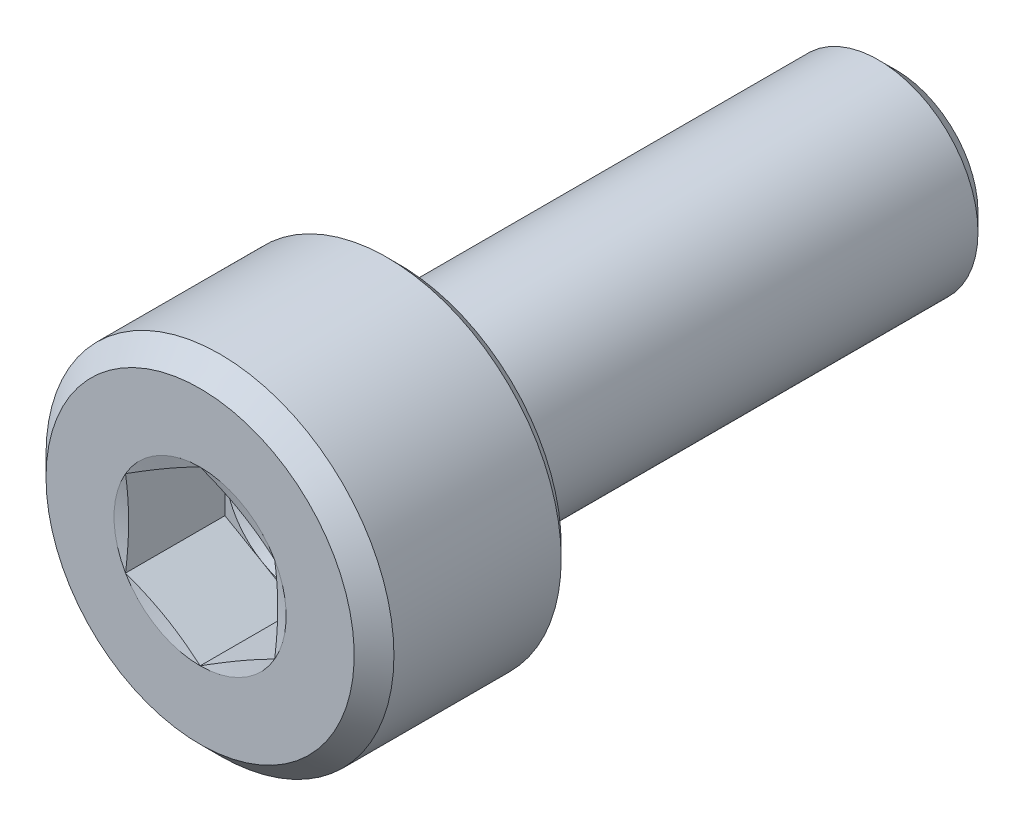
ISO-10303-21;
HEADER;
FILE_DESCRIPTION(('STEP AP214'),'2;1');
FILE_NAME('part.step','',(''),(''),'','','');
FILE_SCHEMA(('AUTOMOTIVE_DESIGN { 1 0 10303 214 1 1 1 1 }'));
ENDSEC;
DATA;
#1=APPLICATION_CONTEXT('core data for automotive mechanical design processes');
#2=APPLICATION_PROTOCOL_DEFINITION('international standard','automotive_design',2000,#1);
#3=PRODUCT_CONTEXT('',#1,'mechanical');
#4=PRODUCT('Part','Part','',(#3));
#5=PRODUCT_RELATED_PRODUCT_CATEGORY('part','',(#4));
#6=PRODUCT_DEFINITION_FORMATION('','',#4);
#7=PRODUCT_DEFINITION_CONTEXT('part definition',#1,'design');
#8=PRODUCT_DEFINITION('design','',#6,#7);
#9=PRODUCT_DEFINITION_SHAPE('','',#8);
#10=(LENGTH_UNIT() NAMED_UNIT(*) SI_UNIT(.MILLI.,.METRE.));
#11=(NAMED_UNIT(*) PLANE_ANGLE_UNIT() SI_UNIT($,.RADIAN.));
#12=(NAMED_UNIT(*) SI_UNIT($,.STERADIAN.) SOLID_ANGLE_UNIT());
#13=UNCERTAINTY_MEASURE_WITH_UNIT(LENGTH_MEASURE(1.E-05),#10,'distance_accuracy_value','');
#14=(GEOMETRIC_REPRESENTATION_CONTEXT(3) GLOBAL_UNCERTAINTY_ASSIGNED_CONTEXT((#13)) GLOBAL_UNIT_ASSIGNED_CONTEXT((#10,
#11,#12)) REPRESENTATION_CONTEXT('',''));
#15=CARTESIAN_POINT('',(0.,0.,0.));
#16=DIRECTION('',(0.,0.,1.));
#17=DIRECTION('',(1.,0.,0.));
#18=AXIS2_PLACEMENT_3D('',#15,#16,#17);
#19=CARTESIAN_POINT('',(1.5,0.86602540378444,-2.));
#20=DIRECTION('',(0.5,0.866025403784439,0.));
#21=DIRECTION('',(0.,0.,-1.));
#22=AXIS2_PLACEMENT_3D('',#19,#20,#21);
#23=PLANE('',#22);
#24=CARTESIAN_POINT('',(0.,1.73205080756888,0.));
#25=CARTESIAN_POINT('',(0.0319218435573803,1.71361827752424,-0.00493884412449916));
#26=CARTESIAN_POINT('',(0.0638693685136447,1.69516679835816,-0.00964662265875806));
#27=CARTESIAN_POINT('',(0.127190873346136,1.65859864303315,-0.0184608187710604));
#28=CARTESIAN_POINT('',(0.158563781120233,1.64048251630664,-0.0225772393424968));
#29=CARTESIAN_POINT('',(0.220898834307869,1.60450191917406,-0.0302102833005078));
#30=CARTESIAN_POINT('',(0.251860146436366,1.58663771475197,-0.0337349193355694));
#31=CARTESIAN_POINT('',(0.313549389158037,1.55105545933978,-0.0401848351737832));
#32=CARTESIAN_POINT('',(0.344276866814156,1.53333756463099,-0.0431152979201941));
#33=CARTESIAN_POINT('',(0.40657799028558,1.49735411977236,-0.0484651508275807));
#34=CARTESIAN_POINT('',(0.438151971802683,1.47908675491275,-0.0508685151660002));
#35=CARTESIAN_POINT('',(0.500879286230978,1.44279961674247,-0.0549795057892075));
#36=CARTESIAN_POINT('',(0.532032121379358,1.42478007054919,-0.0566966624855056));
#37=CARTESIAN_POINT('',(0.594231046797586,1.38885552555366,-0.0594386321092165));
#38=CARTESIAN_POINT('',(0.625276914041384,1.37095039752443,-0.0604667898057636));
#39=CARTESIAN_POINT('',(0.687554215894071,1.33505284045166,-0.0618381368687116));
#40=CARTESIAN_POINT('',(0.718785756622615,1.31706045545343,-0.0621776414822527));
#41=CARTESIAN_POINT('',(0.781203493670746,1.28102196252072,-0.0621780114361709));
#42=CARTESIAN_POINT('',(0.812389701902166,1.2629758752215,-0.0618391104492389));
#43=CARTESIAN_POINT('',(0.874602074626141,1.22699927809648,-0.0604685592128849));
#44=CARTESIAN_POINT('',(0.905628246509567,1.20906864719944,-0.0594404405458585));
#45=CARTESIAN_POINT('',(0.96784038831324,1.17316750001764,-0.0566983997404701));
#46=CARTESIAN_POINT('',(0.999026358555385,1.15519725365838,-0.0549809740548094));
#47=CARTESIAN_POINT('',(1.06183015892586,1.1190091539659,-0.0508694613979863));
#48=CARTESIAN_POINT('',(1.09344751791267,1.10079159059446,-0.0484656958203877));
#49=CARTESIAN_POINT('',(1.15576484073738,1.06482303125522,-0.0431161350968404));
#50=CARTESIAN_POINT('',(1.18646658596711,1.04707267876494,-0.0401866752582224));
#51=CARTESIAN_POINT('',(1.24811844318503,1.01144233108145,-0.0337380416147382));
#52=CARTESIAN_POINT('',(1.27906819922818,0.993562671876557,-0.0302136197071947));
#53=CARTESIAN_POINT('',(1.34139616186306,0.957570532953329,-0.0225805303875789));
#54=CARTESIAN_POINT('',(1.37277371933127,0.939458651913147,-0.0184637865548303));
#55=CARTESIAN_POINT('',(1.43611136843188,0.902901776632724,-0.00964841178692371));
#56=CARTESIAN_POINT('',(1.46807043895857,0.88445743514902,-0.00493971563973908));
#57=CARTESIAN_POINT('',(1.5,0.86602540378444,0.));
#58=B_SPLINE_CURVE_WITH_KNOTS('',3,(#24,#25,#26,#27,#28,#29,#30,#31,#32,#33,#34,#35,#36,#37,#38,
#39,#40,#41,#42,#43,#44,#45,#46,#47,#48,#49,#50,#51,#52,#53,#54,#55,#56,#57),.UNSPECIFIED.,.F.,
.F.,(4,2,2,2,2,2,2,2,2,2,2,2,2,2,2,2,4),(0.,0.111572720232699,0.220951956478326,
0.328703835667225,0.435471008922913,0.545135332388369,0.653218713706919,0.760773524264254,
0.868902322588974,0.976993883014083,1.08453576845485,1.19263132381972,1.30233363891238,
1.40908245805682,1.51682745868587,1.62621248072106,1.73780468248118),.UNSPECIFIED.);
#59=CARTESIAN_POINT('',(0.,1.73205080756888,0.));
#60=VERTEX_POINT('',#59);
#61=CARTESIAN_POINT('',(1.5,0.866025403784441,0.));
#62=VERTEX_POINT('',#61);
#63=EDGE_CURVE('E256',#60,#62,#58,.T.);
#64=ORIENTED_EDGE('',*,*,#63,.F.);
#65=DIRECTION('',(0.,0.,1.));
#66=VECTOR('',#65,1.);
#67=CARTESIAN_POINT('',(0.,1.73205080756888,-2.));
#68=LINE('',#67,#66);
#69=CARTESIAN_POINT('',(0.,1.73205080756888,-2.));
#70=VERTEX_POINT('',#69);
#71=EDGE_CURVE('E417',#70,#60,#68,.T.);
#72=ORIENTED_EDGE('',*,*,#71,.F.);
#73=DIRECTION('',(-0.866025403784439,0.5,0.));
#74=VECTOR('',#73,1.);
#75=CARTESIAN_POINT('',(1.5,0.86602540378444,-2.));
#76=LINE('',#75,#74);
#77=CARTESIAN_POINT('',(0.75,1.29903810567666,-2.));
#78=VERTEX_POINT('',#77);
#79=EDGE_CURVE('E126',#78,#70,#76,.T.);
#80=ORIENTED_EDGE('',*,*,#79,.F.);
#81=DIRECTION('',(-0.866025403784439,0.5,0.));
#82=VECTOR('',#81,1.);
#83=CARTESIAN_POINT('',(1.5,0.86602540378444,-2.));
#84=LINE('',#83,#82);
#85=CARTESIAN_POINT('',(1.5,0.86602540378444,-2.));
#86=VERTEX_POINT('',#85);
#87=EDGE_CURVE('E212',#86,#78,#84,.T.);
#88=ORIENTED_EDGE('',*,*,#87,.F.);
#89=DIRECTION('',(0.,0.,1.));
#90=VECTOR('',#89,1.);
#91=CARTESIAN_POINT('',(1.5,0.86602540378444,-2.));
#92=LINE('',#91,#90);
#93=EDGE_CURVE('E11',#86,#62,#92,.T.);
#94=ORIENTED_EDGE('',*,*,#93,.T.);
#95=EDGE_LOOP('',(#64,#72,#80,#88,#94));
#96=FACE_BOUND('',#95,.T.);
#97=ADVANCED_FACE('F16',(#96),#23,.F.);
#98=CARTESIAN_POINT('',(1.5,-0.866025403784439,-2.));
#99=DIRECTION('',(1.,0.,0.));
#100=DIRECTION('',(0.,-1.,0.));
#101=AXIS2_PLACEMENT_3D('',#98,#99,#100);
#102=PLANE('',#101);
#103=CARTESIAN_POINT('',(1.5,0.86602540378444,0.));
#104=CARTESIAN_POINT('',(1.49999788437901,0.829199928917708,-0.00493403058548651));
#105=CARTESIAN_POINT('',(1.49999212365608,0.792342804583024,-0.00963746630519228));
#106=CARTESIAN_POINT('',(1.49998367742636,0.719291943469374,-0.0184441406631844));
#107=CARTESIAN_POINT('',(1.49998093369849,0.68309940729587,-0.0225573596134164));
#108=CARTESIAN_POINT('',(1.49998795566567,0.611195736608794,-0.0301851630975857));
#109=CARTESIAN_POINT('',(1.49999753576162,0.575485455570638,-0.0337077471297975));
#110=CARTESIAN_POINT('',(1.50002680410694,0.504340575414326,-0.040154696010694));
#111=CARTESIAN_POINT('',(1.50004639897075,0.468906447013271,-0.0430842445185843));
#112=CARTESIAN_POINT('',(1.50003448346486,0.396956456479814,-0.048439196202735));
#113=CARTESIAN_POINT('',(1.50000145981111,0.360439301866925,-0.0508473248473678));
#114=CARTESIAN_POINT('',(1.49993852599375,0.287896529733626,-0.0549666645148848));
#115=CARTESIAN_POINT('',(1.49990857763219,0.25187146148816,-0.0566874732422629));
#116=CARTESIAN_POINT('',(1.49989756801784,0.179973446880944,-0.0594339881954357));
#117=CARTESIAN_POINT('',(1.49991626529232,0.144100631127306,-0.060463096019766));
#118=CARTESIAN_POINT('',(1.49996202085769,0.0721519187191579,-0.061839348150352));
#119=CARTESIAN_POINT('',(1.49998912289494,0.036075952496566,-0.0621828526918632));
#120=CARTESIAN_POINT('',(1.5,0.,-0.0621778264910693));
#121=B_SPLINE_CURVE_WITH_KNOTS('',3,(#103,#104,#105,#106,#107,#108,#109,#110,#111,#112,#113,
#114,#115,#116,#117,#118,#119,#120),.UNSPECIFIED.,.F.,.F.,(4,2,2,2,2,2,2,2,4),(0.,
0.111464002335777,0.220737054899247,0.328383540660502,0.435044078200038,0.544827888914773,
0.6530200605594,0.760676201428846,0.868902368325059),.UNSPECIFIED.);
#122=CARTESIAN_POINT('',(1.5,0.,-0.0621778264910693));
#123=VERTEX_POINT('',#122);
#124=EDGE_CURVE('E492',#62,#123,#121,.T.);
#125=ORIENTED_EDGE('',*,*,#124,.F.);
#126=ORIENTED_EDGE('',*,*,#93,.F.);
#127=DIRECTION('',(0.,1.,0.));
#128=VECTOR('',#127,1.);
#129=CARTESIAN_POINT('',(1.5,-0.866025403784439,-2.));
#130=LINE('',#129,#128);
#131=CARTESIAN_POINT('',(1.5,0.,-2.));
#132=VERTEX_POINT('',#131);
#133=EDGE_CURVE('E239',#132,#86,#130,.T.);
#134=ORIENTED_EDGE('',*,*,#133,.F.);
#135=DIRECTION('',(0.,1.,0.));
#136=VECTOR('',#135,1.);
#137=CARTESIAN_POINT('',(1.5,-0.866025403784439,-2.));
#138=LINE('',#137,#136);
#139=CARTESIAN_POINT('',(1.5,-0.866025403784439,-2.));
#140=VERTEX_POINT('',#139);
#141=EDGE_CURVE('E136',#140,#132,#138,.T.);
#142=ORIENTED_EDGE('',*,*,#141,.F.);
#143=DIRECTION('',(0.,0.,1.));
#144=VECTOR('',#143,1.);
#145=CARTESIAN_POINT('',(1.5,-0.866025403784439,-2.));
#146=LINE('',#145,#144);
#147=CARTESIAN_POINT('',(1.5,-0.866025403784438,0.));
#148=VERTEX_POINT('',#147);
#149=EDGE_CURVE('E29',#140,#148,#146,.T.);
#150=ORIENTED_EDGE('',*,*,#149,.T.);
#151=CARTESIAN_POINT('',(1.5,0.,-0.0621778264910693));
#152=CARTESIAN_POINT('',(1.49998917237469,-0.0360465890798884,-0.0621828333609689));
#153=CARTESIAN_POINT('',(1.49996321712326,-0.0720931866322869,-0.0618395946441951));
#154=CARTESIAN_POINT('',(1.49992055969235,-0.143989874327615,-0.0604646459344438));
#155=CARTESIAN_POINT('',(1.49990381112655,-0.179840031540118,-0.0594364461227482));
#156=CARTESIAN_POINT('',(1.49991820406301,-0.251698944784657,-0.056692482890539));
#157=CARTESIAN_POINT('',(1.49994959286198,-0.287707565805736,-0.0549732027081495));
#158=CARTESIAN_POINT('',(1.50001291187399,-0.360223225310859,-0.0508578079954488));
#159=CARTESIAN_POINT('',(1.5000448431949,-0.396729709706729,-0.0484520053406438));
#160=CARTESIAN_POINT('',(1.50005357837135,-0.468686666432951,-0.0431000871668579));
#161=CARTESIAN_POINT('',(1.5000318838889,-0.504138394952606,-0.0401707733030463));
#162=CARTESIAN_POINT('',(1.49999977329943,-0.57531955436455,-0.0337232219030494));
#163=CARTESIAN_POINT('',(1.49998946362536,-0.611048512498729,-0.0301997759390277));
#164=CARTESIAN_POINT('',(1.49998142841051,-0.682991208938279,-0.0225693637917121));
#165=CARTESIAN_POINT('',(1.49998389589917,-0.719204090436432,-0.0184543654872015));
#166=CARTESIAN_POINT('',(1.49999206648556,-0.792297816258988,-0.00964321952563205));
#167=CARTESIAN_POINT('',(1.49999783362551,-0.829177455418944,-0.0049370528179985));
#168=CARTESIAN_POINT('',(1.5,-0.866025403784436,0.));
#169=B_SPLINE_CURVE_WITH_KNOTS('',3,(#151,#152,#153,#154,#155,#156,#157,#158,#159,#160,#161,
#162,#163,#164,#165,#166,#167,#168),.UNSPECIFIED.,.F.,.F.,(4,2,2,2,2,2,2,2,4),(0.,
0.108138070217073,0.215726191203815,0.323868880462267,0.433620301314751,0.540333393586546,
0.64803588186531,0.757370175799668,0.868902207142523),.UNSPECIFIED.);
#170=EDGE_CURVE('E449',#123,#148,#169,.T.);
#171=ORIENTED_EDGE('',*,*,#170,.F.);
#172=EDGE_LOOP('',(#125,#126,#134,#142,#150,#171));
#173=FACE_BOUND('',#172,.T.);
#174=ADVANCED_FACE('F298',(#173),#102,.F.);
#175=CARTESIAN_POINT('',(0.,-1.73205080756887,-2.));
#176=DIRECTION('',(0.5,-0.866025403784439,0.));
#177=DIRECTION('',(0.,0.,-1.));
#178=AXIS2_PLACEMENT_3D('',#175,#176,#177);
#179=PLANE('',#178);
#180=CARTESIAN_POINT('',(1.5,-0.866025403784436,0.));
#181=CARTESIAN_POINT('',(1.46807603894706,-0.884454266218195,-0.00493884412443326));
#182=CARTESIAN_POINT('',(1.43612282677415,-0.902895894835115,-0.00964662265862214));
#183=CARTESIAN_POINT('',(1.37279312287752,-0.939449848963183,-0.0184608187708344));
#184=CARTESIAN_POINT('',(1.34141764302729,-0.957561520722868,-0.0225772393422461));
#185=CARTESIAN_POINT('',(1.27909000527335,-0.993554961763424,-0.0302102833002547));
#186=CARTESIAN_POINT('',(1.24813849436103,-1.01143614239027,-0.0337349193353338));
#187=CARTESIAN_POINT('',(1.1864787358887,-1.0470694660216,-0.0401848351736417));
#188=CARTESIAN_POINT('',(1.15577085014079,-1.06482129491176,-0.0431152979201243));
#189=CARTESIAN_POINT('',(1.09345771104134,-1.10078392809297,-0.0484651508276134));
#190=CARTESIAN_POINT('',(1.06185071825413,-1.11899411575542,-0.0508685151660728));
#191=CARTESIAN_POINT('',(0.999061477553865,-1.15517399447615,-0.0549795057893279));
#192=CARTESIAN_POINT('',(0.967879675211638,-1.17314336801787,-0.0566966624856342));
#193=CARTESIAN_POINT('',(0.905668643917024,-1.20904694502039,-0.0594386321093453));
#194=CARTESIAN_POINT('',(0.874639414563802,-1.22698089072146,-0.0604667898058839));
#195=CARTESIAN_POINT('',(0.812412567278663,-1.26296583766887,-0.0618381368687843));
#196=CARTESIAN_POINT('',(0.78121493443127,-1.28101695284018,-0.0621776414822849));
#197=CARTESIAN_POINT('',(0.71879581551281,-1.31705305230483,-0.0621780114361394));
#198=CARTESIAN_POINT('',(0.687574341356492,-1.33503805723177,-0.0618391104491723));
#199=CARTESIAN_POINT('',(0.625311507941697,-1.37092725387842,-0.0604685592127698));
#200=CARTESIAN_POINT('',(0.594270040137024,-1.38883139146319,-0.0594404405457388));
#201=CARTESIAN_POINT('',(0.532072663750656,-1.42475811309799,-0.0566983997403538));
#202=CARTESIAN_POINT('',(0.500916988770352,-1.44278083238954,-0.0549809740547099));
#203=CARTESIAN_POINT('',(0.438175274937558,-1.47907646911783,-0.0508694613979232));
#204=CARTESIAN_POINT('',(0.406589722770089,-1.49734912351494,-0.0484656958203525));
#205=CARTESIAN_POINT('',(0.344281375232864,-1.53333322850726,-0.0431161350968009));
#206=CARTESIAN_POINT('',(0.313558246435083,-1.55104654357181,-0.0401866752581339));
#207=CARTESIAN_POINT('',(0.251875531586233,-1.58662344427154,-0.0337380416145872));
#208=CARTESIAN_POINT('',(0.220916414482101,-1.60448688964343,-0.0302136197070334));
#209=CARTESIAN_POINT('',(0.158582326520561,-1.64046841918969,-0.0225805303874198));
#210=CARTESIAN_POINT('',(0.127208198695392,-1.6585862405457,-0.0184637865546869));
#211=CARTESIAN_POINT('',(0.0638801914695765,-1.69515981604234,-0.00964841178683726));
#212=CARTESIAN_POINT('',(0.0319273879255215,-1.71361501225776,-0.00493971563969701));
#213=CARTESIAN_POINT('',(0.,-1.73205080756888,0.));
#214=B_SPLINE_CURVE_WITH_KNOTS('',3,(#180,#181,#182,#183,#184,#185,#186,#187,#188,#189,#190,
#191,#192,#193,#194,#195,#196,#197,#198,#199,#200,#201,#202,#203,#204,#205,#206,#207,#208,#209,
#210,#211,#212,#213),.UNSPECIFIED.,.F.,.F.,(4,2,2,2,2,2,2,2,2,2,2,2,2,2,2,2,4),(0.,
0.111572720231218,0.220951956476404,0.328703835665831,0.435471008922919,0.54513533238821,
0.653218713706672,0.760773524264044,0.868902322588982,0.976993883016217,1.08453576845772,
1.1926313238219,1.30233363891239,1.40908245805771,1.51682745868709,1.62621248072201,
1.73780468248119),.UNSPECIFIED.);
#215=CARTESIAN_POINT('',(0.,-1.73205080756888,0.));
#216=VERTEX_POINT('',#215);
#217=EDGE_CURVE('E454',#148,#216,#214,.T.);
#218=ORIENTED_EDGE('',*,*,#217,.F.);
#219=ORIENTED_EDGE('',*,*,#149,.F.);
#220=DIRECTION('',(0.866025403784439,0.5,0.));
#221=VECTOR('',#220,1.);
#222=CARTESIAN_POINT('',(0.,-1.73205080756887,-2.));
#223=LINE('',#222,#221);
#224=CARTESIAN_POINT('',(0.75,-1.29903810567666,-2.));
#225=VERTEX_POINT('',#224);
#226=EDGE_CURVE('E209',#225,#140,#223,.T.);
#227=ORIENTED_EDGE('',*,*,#226,.F.);
#228=DIRECTION('',(0.866025403784439,0.5,0.));
#229=VECTOR('',#228,1.);
#230=CARTESIAN_POINT('',(0.,-1.73205080756887,-2.));
#231=LINE('',#230,#229);
#232=CARTESIAN_POINT('',(0.,-1.73205080756887,-2.));
#233=VERTEX_POINT('',#232);
#234=EDGE_CURVE('E149',#233,#225,#231,.T.);
#235=ORIENTED_EDGE('',*,*,#234,.F.);
#236=DIRECTION('',(0.,0.,1.));
#237=VECTOR('',#236,1.);
#238=CARTESIAN_POINT('',(0.,-1.73205080756887,-2.));
#239=LINE('',#238,#237);
#240=EDGE_CURVE('E316',#233,#216,#239,.T.);
#241=ORIENTED_EDGE('',*,*,#240,.T.);
#242=EDGE_LOOP('',(#218,#219,#227,#235,#241));
#243=FACE_BOUND('',#242,.T.);
#244=ADVANCED_FACE('F293',(#243),#179,.F.);
#245=CARTESIAN_POINT('',(-1.5,-0.866025403784438,-2.));
#246=DIRECTION('',(-0.5,-0.866025403784439,0.));
#247=DIRECTION('',(-0.866025403784439,0.5,0.));
#248=AXIS2_PLACEMENT_3D('',#245,#246,#247);
#249=PLANE('',#248);
#250=CARTESIAN_POINT('',(0.,-1.73205080756888,0.));
#251=CARTESIAN_POINT('',(-0.0319218435569443,-1.71361827752449,-0.00493884412443161));
#252=CARTESIAN_POINT('',(-0.0638693685127974,-1.69516679835871,-0.00964662265861877));
#253=CARTESIAN_POINT('',(-0.127190873344782,-1.65859864303412,-0.0184608187708289));
#254=CARTESIAN_POINT('',(-0.158563781118785,-1.64048251630774,-0.0225772393422399));
#255=CARTESIAN_POINT('',(-0.220898834306495,-1.60450191917523,-0.0302102833002482));
#256=CARTESIAN_POINT('',(-0.251860146435161,-1.58663771475308,-0.0337349193353275));
#257=CARTESIAN_POINT('',(-0.313549389157348,-1.55105545934048,-0.0401848351736387));
#258=CARTESIAN_POINT('',(-0.344276866813814,-1.53333756463134,-0.0431152979201242));
#259=CARTESIAN_POINT('',(-0.406577990285268,-1.49735411977238,-0.0484651508275963));
#260=CARTESIAN_POINT('',(-0.438151971802054,-1.47908675491278,-0.0508685151660395));
#261=CARTESIAN_POINT('',(-0.500879286229949,-1.44279961674256,-0.0549795057892744));
#262=CARTESIAN_POINT('',(-0.532032121378246,-1.42478007054933,-0.0566966624855738));
#263=CARTESIAN_POINT('',(-0.594231046796497,-1.38885552555386,-0.0594386321092837));
#264=CARTESIAN_POINT('',(-0.625276914040401,-1.37095039752462,-0.0604667898058252));
#265=CARTESIAN_POINT('',(-0.687554215893493,-1.3350528404518,-0.06183813686875));
#266=CARTESIAN_POINT('',(-0.718785756622337,-1.31706045545352,-0.0621776414822695));
#267=CARTESIAN_POINT('',(-0.781203493671238,-1.2810219625205,-0.0621780114361548));
#268=CARTESIAN_POINT('',(-0.812389701903129,-1.26297587522104,-0.0618391104492068));
#269=CARTESIAN_POINT('',(-0.874602074627703,-1.22699927809563,-0.0604685592128287));
#270=CARTESIAN_POINT('',(-0.905628246511258,-1.20906864719845,-0.0594404405458008));
#271=CARTESIAN_POINT('',(-0.967840388314882,-1.17316750001655,-0.0566983997404147));
#272=CARTESIAN_POINT('',(-0.999026358556849,-1.15519725365733,-0.0549809740547644));
#273=CARTESIAN_POINT('',(-1.06183015892671,-1.11900915396522,-0.0508694613979569));
#274=CARTESIAN_POINT('',(-1.09344751791309,-1.10079159059412,-0.0484656958203696));
#275=CARTESIAN_POINT('',(-1.1557648407377,-1.06482303125513,-0.0431161350967959));
#276=CARTESIAN_POINT('',(-1.18646658596774,-1.04707267876477,-0.0401866752581259));
#277=CARTESIAN_POINT('',(-1.24811844318608,-1.01144233108113,-0.0337380416145749));
#278=CARTESIAN_POINT('',(-1.27906819922932,-0.993562671876153,-0.03021361970702));
#279=CARTESIAN_POINT('',(-1.34139616186418,-0.957570532952857,-0.0225805303874063));
#280=CARTESIAN_POINT('',(-1.37277371933229,-0.939458651912687,-0.0184637865546747));
#281=CARTESIAN_POINT('',(-1.43611136843248,-0.902901776632417,-0.00964841178682995));
#282=CARTESIAN_POINT('',(-1.46807043895887,-0.884457435148856,-0.00493971563969346));
#283=CARTESIAN_POINT('',(-1.5,-0.866025403784444,0.));
#284=B_SPLINE_CURVE_WITH_KNOTS('',3,(#250,#251,#252,#253,#254,#255,#256,#257,#258,#259,#260,
#261,#262,#263,#264,#265,#266,#267,#268,#269,#270,#271,#272,#273,#274,#275,#276,#277,#278,#279,
#280,#281,#282,#283),.UNSPECIFIED.,.F.,.F.,(4,2,2,2,2,2,2,2,2,2,2,2,2,2,2,2,4),(0.,
0.11157272023118,0.220951956476355,0.328703835665791,0.435471008922913,0.545135332387537,
0.653218713705794,0.760773524263399,0.868902322588981,0.976993883015684,1.084535768457,
1.19263132382134,1.30233363891239,1.40908245805779,1.5168274586872,1.62621248072208,
1.73780468248118),.UNSPECIFIED.);
#285=CARTESIAN_POINT('',(-1.5,-0.866025403784441,0.));
#286=VERTEX_POINT('',#285);
#287=EDGE_CURVE('E342',#216,#286,#284,.T.);
#288=ORIENTED_EDGE('',*,*,#287,.F.);
#289=ORIENTED_EDGE('',*,*,#240,.F.);
#290=DIRECTION('',(0.866025403784439,-0.5,0.));
#291=VECTOR('',#290,1.);
#292=CARTESIAN_POINT('',(-1.5,-0.866025403784438,-2.));
#293=LINE('',#292,#291);
#294=CARTESIAN_POINT('',(-0.75,-1.29903810567666,-2.));
#295=VERTEX_POINT('',#294);
#296=EDGE_CURVE('E224',#295,#233,#293,.T.);
#297=ORIENTED_EDGE('',*,*,#296,.F.);
#298=DIRECTION('',(0.866025403784439,-0.5,0.));
#299=VECTOR('',#298,1.);
#300=CARTESIAN_POINT('',(-1.5,-0.866025403784438,-2.));
#301=LINE('',#300,#299);
#302=CARTESIAN_POINT('',(-1.5,-0.866025403784438,-2.));
#303=VERTEX_POINT('',#302);
#304=EDGE_CURVE('E198',#303,#295,#301,.T.);
#305=ORIENTED_EDGE('',*,*,#304,.F.);
#306=DIRECTION('',(0.,0.,1.));
#307=VECTOR('',#306,1.);
#308=CARTESIAN_POINT('',(-1.5,-0.866025403784438,-2.));
#309=LINE('',#308,#307);
#310=EDGE_CURVE('E329',#303,#286,#309,.T.);
#311=ORIENTED_EDGE('',*,*,#310,.T.);
#312=EDGE_LOOP('',(#288,#289,#297,#305,#311));
#313=FACE_BOUND('',#312,.T.);
#314=ADVANCED_FACE('F297',(#313),#249,.F.);
#315=CARTESIAN_POINT('',(-1.5,0.86602540378444,-2.));
#316=DIRECTION('',(-1.,0.,0.));
#317=DIRECTION('',(0.,0.,1.));
#318=AXIS2_PLACEMENT_3D('',#315,#316,#317);
#319=PLANE('',#318);
#320=CARTESIAN_POINT('',(-1.5,-0.866025403784444,0.));
#321=CARTESIAN_POINT('',(-1.49999785704583,-0.829118007047485,-0.00494501576360788));
#322=CARTESIAN_POINT('',(-1.49999259051275,-0.792178800357398,-0.00965828039353506));
#323=CARTESIAN_POINT('',(-1.49998571753542,-0.718964095246033,-0.0184820232028856));
#324=CARTESIAN_POINT('',(-1.49998404127704,-0.682689801352141,-0.0226025173975769));
#325=CARTESIAN_POINT('',(-1.49999334263018,-0.610621683828277,-0.0302422926175349));
#326=CARTESIAN_POINT('',(-1.5000041329169,-0.574828714317346,-0.0337695848077828));
#327=CARTESIAN_POINT('',(-1.50003530309437,-0.503516074393159,-0.040223386947631));
#328=CARTESIAN_POINT('',(-1.5000555950549,-0.467996872155556,-0.0431550593772779));
#329=CARTESIAN_POINT('',(-1.50004365096737,-0.395917674670658,-0.048508264506497));
#330=CARTESIAN_POINT('',(-1.50000992517332,-0.359356438333572,-0.0509131764932561));
#331=CARTESIAN_POINT('',(-1.49994602299741,-0.286727055786137,-0.0550239062884565));
#332=CARTESIAN_POINT('',(-1.49991580218215,-0.250659459534994,-0.0567393694733551));
#333=CARTESIAN_POINT('',(-1.49990161802752,-0.178676428175191,-0.05947462175525));
#334=CARTESIAN_POINT('',(-1.49991742656152,-0.142761123136474,-0.060497810819715));
#335=CARTESIAN_POINT('',(-1.49996695712204,-0.0707259651243944,-0.0618559402838836));
#336=CARTESIAN_POINT('',(-1.50000077423698,-0.0346060428143578,-0.0621871809405733));
#337=CARTESIAN_POINT('',(-1.49999922827671,0.0375163454427191,-0.0621680937314055));
#338=CARTESIAN_POINT('',(-1.49996408945079,0.0735188119956903,-0.061819975207021));
#339=CARTESIAN_POINT('',(-1.49991363568062,0.145328707173365,-0.0604323235082698));
#340=CARTESIAN_POINT('',(-1.49989822156939,0.1811362029976,-0.0593962891611449));
#341=CARTESIAN_POINT('',(-1.49991255470042,0.252909744257705,-0.0566396987586207));
#342=CARTESIAN_POINT('',(-1.49994253544849,0.288875654121043,-0.0549156372223943));
#343=CARTESIAN_POINT('',(-1.50000405152831,0.361304331881828,-0.05079210067078));
#344=CARTESIAN_POINT('',(-1.50003560333469,0.397766546398477,-0.0483829754895413));
#345=CARTESIAN_POINT('',(-1.50004454637235,0.469594312950293,-0.04302926669563));
#346=CARTESIAN_POINT('',(-1.50002347300874,0.504961172034931,-0.0401021250666466));
#347=CARTESIAN_POINT('',(-1.49999320024247,0.575974957711393,-0.0336614679609277));
#348=CARTESIAN_POINT('',(-1.49998411376892,0.611621409044824,-0.0301427229573248));
#349=CARTESIAN_POINT('',(-1.49997835783799,0.683400006980931,-0.0225242698854443));
#350=CARTESIAN_POINT('',(-1.49998187928113,0.7195312974495,-0.0184165418148768));
#351=CARTESIAN_POINT('',(-1.4999916000686,0.792461504347963,-0.0096224450166885));
#352=CARTESIAN_POINT('',(-1.49999785189064,0.829259219546507,-0.00492609301900303));
#353=CARTESIAN_POINT('',(-1.5,0.866025403784438,0.));
#354=B_SPLINE_CURVE_WITH_KNOTS('',3,(#320,#321,#322,#323,#324,#325,#326,#327,#328,#329,#330,
#331,#332,#333,#334,#335,#336,#337,#338,#339,#340,#341,#342,#343,#344,#345,#346,#347,#348,#349,
#350,#351,#352,#353),.UNSPECIFIED.,.F.,.F.,(4,2,2,2,2,2,2,2,2,2,2,2,2,2,2,2,4),(0.,
0.111711969879774,0.221231164281875,0.329125871340509,0.436041258334956,0.545956358266136,
0.654275218879987,0.762058154278094,0.870415928826334,0.9784219006474,1.08588270569063,
1.19389815741617,1.30351771993845,1.40997657219085,1.51743138131477,1.6265200328025,
1.73780457403362),.UNSPECIFIED.);
#355=CARTESIAN_POINT('',(-1.5,0.86602540378444,0.));
#356=VERTEX_POINT('',#355);
#357=EDGE_CURVE('E382',#286,#356,#354,.T.);
#358=ORIENTED_EDGE('',*,*,#357,.F.);
#359=ORIENTED_EDGE('',*,*,#310,.F.);
#360=DIRECTION('',(0.,-1.,0.));
#361=VECTOR('',#360,1.);
#362=CARTESIAN_POINT('',(-1.5,0.86602540378444,-2.));
#363=LINE('',#362,#361);
#364=CARTESIAN_POINT('',(-1.5,0.,-2.));
#365=VERTEX_POINT('',#364);
#366=EDGE_CURVE('E247',#365,#303,#363,.T.);
#367=ORIENTED_EDGE('',*,*,#366,.F.);
#368=DIRECTION('',(0.,-1.,0.));
#369=VECTOR('',#368,1.);
#370=CARTESIAN_POINT('',(-1.5,0.86602540378444,-2.));
#371=LINE('',#370,#369);
#372=CARTESIAN_POINT('',(-1.5,0.86602540378444,-2.));
#373=VERTEX_POINT('',#372);
#374=EDGE_CURVE('E200',#373,#365,#371,.T.);
#375=ORIENTED_EDGE('',*,*,#374,.F.);
#376=DIRECTION('',(0.,0.,1.));
#377=VECTOR('',#376,1.);
#378=CARTESIAN_POINT('',(-1.5,0.86602540378444,-2.));
#379=LINE('',#378,#377);
#380=EDGE_CURVE('E44',#373,#356,#379,.T.);
#381=ORIENTED_EDGE('',*,*,#380,.T.);
#382=EDGE_LOOP('',(#358,#359,#367,#375,#381));
#383=FACE_BOUND('',#382,.T.);
#384=ADVANCED_FACE('F389',(#383),#319,.F.);
#385=CARTESIAN_POINT('',(0.,1.73205080756888,-2.));
#386=DIRECTION('',(-0.5,0.866025403784439,0.));
#387=DIRECTION('',(0.,0.,1.));
#388=AXIS2_PLACEMENT_3D('',#385,#386,#387);
#389=PLANE('',#388);
#390=CARTESIAN_POINT('',(-1.5,0.866025403784438,0.));
#391=CARTESIAN_POINT('',(-1.4680760389469,0.884454266218287,-0.00493884412445722));
#392=CARTESIAN_POINT('',(-1.43612282677384,0.902895894835281,-0.00964662265867159));
#393=CARTESIAN_POINT('',(-1.37279312287698,0.93944984896343,-0.0184608187709167));
#394=CARTESIAN_POINT('',(-1.34141764302669,0.957561520723122,-0.0225772393423374));
#395=CARTESIAN_POINT('',(-1.27909000527274,0.993554961763642,-0.0302102833003466));
#396=CARTESIAN_POINT('',(-1.24813849436048,1.01143614239044,-0.033734919335419));
#397=CARTESIAN_POINT('',(-1.18647873588836,1.04706946602169,-0.0401848351736938));
#398=CARTESIAN_POINT('',(-1.15577085014062,1.06482129491179,-0.0431152979201517));
#399=CARTESIAN_POINT('',(-1.09345771104158,1.10078392809289,-0.0484651508275798));
#400=CARTESIAN_POINT('',(-1.06185071825463,1.11899411575529,-0.0508685151660037));
#401=CARTESIAN_POINT('',(-0.999061477554704,1.15517399447597,-0.0549795057892155));
#402=CARTESIAN_POINT('',(-0.967879675212563,1.17314336801771,-0.0566966624855106));
#403=CARTESIAN_POINT('',(-0.90566864391796,1.20904694502028,-0.0594386321092195));
#404=CARTESIAN_POINT('',(-0.874639414564665,1.2269808907214,-0.060466789805764));
#405=CARTESIAN_POINT('',(-0.812412567279182,1.26296583766885,-0.0618381368687151));
#406=CARTESIAN_POINT('',(-0.781214934431518,1.28101695284015,-0.062177641482258));
#407=CARTESIAN_POINT('',(-0.718795815513718,1.3170530523042,-0.0621780114361658));
#408=CARTESIAN_POINT('',(-0.687574341358331,1.33503805723053,-0.0618391104492348));
#409=CARTESIAN_POINT('',(-0.62531150794486,1.3709272538765,-0.060468559212884));
#410=CARTESIAN_POINT('',(-0.594270040140579,1.38883139146119,-0.0594404405458545));
#411=CARTESIAN_POINT('',(-0.532072663754341,1.42475811309619,-0.056698399740464));
#412=CARTESIAN_POINT('',(-0.500916988773776,1.44278083238801,-0.054980974054799));
#413=CARTESIAN_POINT('',(-0.438175274939668,1.479076469117,-0.050869461397982));
#414=CARTESIAN_POINT('',(-0.406589722771145,1.49734912351454,-0.0484656958203894));
#415=CARTESIAN_POINT('',(-0.344281375233356,1.53333322850678,-0.0431161350968965));
#416=CARTESIAN_POINT('',(-0.313558246436066,1.55104654357081,-0.0401866752583401));
#417=CARTESIAN_POINT('',(-0.251875531587953,1.58662344426995,-0.0337380416149358));
#418=CARTESIAN_POINT('',(-0.220916414484067,1.60448688964175,-0.0302136197074065));
#419=CARTESIAN_POINT('',(-0.158582326522636,1.64046841918812,-0.0225805303877882));
#420=CARTESIAN_POINT('',(-0.127208198697331,1.65858624054432,-0.018463786555019));
#421=CARTESIAN_POINT('',(-0.0638801914707876,1.69515981604156,-0.00964841178703725));
#422=CARTESIAN_POINT('',(-0.031927387926141,1.7136150122574,-0.00493971563979419));
#423=CARTESIAN_POINT('',(0.,1.73205080756888,0.));
#424=B_SPLINE_CURVE_WITH_KNOTS('',3,(#390,#391,#392,#393,#394,#395,#396,#397,#398,#399,#400,
#401,#402,#403,#404,#405,#406,#407,#408,#409,#410,#411,#412,#413,#414,#415,#416,#417,#418,#419,
#420,#421,#422,#423),.UNSPECIFIED.,.F.,.F.,(4,2,2,2,2,2,2,2,2,2,2,2,2,2,2,2,4),(0.,
0.111572720231759,0.220951956477106,0.328703835666338,0.435471008922914,0.545135332387461,
0.653218713705708,0.760773524263346,0.868902322588979,0.97699388301289,1.08453576845326,
1.19263132381853,1.30233363891239,1.40908245805565,1.51682745868426,1.62621248071982,
1.73780468248119),.UNSPECIFIED.);
#425=EDGE_CURVE('E323',#356,#60,#424,.T.);
#426=ORIENTED_EDGE('',*,*,#425,.F.);
#427=ORIENTED_EDGE('',*,*,#380,.F.);
#428=DIRECTION('',(-0.866025403784439,-0.5,0.));
#429=VECTOR('',#428,1.);
#430=CARTESIAN_POINT('',(0.,1.73205080756888,-2.));
#431=LINE('',#430,#429);
#432=CARTESIAN_POINT('',(-0.75,1.29903810567666,-2.));
#433=VERTEX_POINT('',#432);
#434=EDGE_CURVE('E202',#433,#373,#431,.T.);
#435=ORIENTED_EDGE('',*,*,#434,.F.);
#436=DIRECTION('',(-0.866025403784439,-0.5,0.));
#437=VECTOR('',#436,1.);
#438=CARTESIAN_POINT('',(0.,1.73205080756888,-2.));
#439=LINE('',#438,#437);
#440=EDGE_CURVE('E227',#70,#433,#439,.T.);
#441=ORIENTED_EDGE('',*,*,#440,.F.);
#442=ORIENTED_EDGE('',*,*,#71,.T.);
#443=EDGE_LOOP('',(#426,#427,#435,#441,#442));
#444=FACE_BOUND('',#443,.T.);
#445=ADVANCED_FACE('F399',(#444),#389,.F.);
#446=CARTESIAN_POINT('',(0.,0.,-2.));
#447=DIRECTION('',(0.,0.,1.));
#448=DIRECTION('',(1.,0.,0.));
#449=AXIS2_PLACEMENT_3D('',#446,#447,#448);
#450=PLANE('',#449);
#451=CARTESIAN_POINT('',(0.,0.,-2.));
#452=DIRECTION('',(0.,0.,1.));
#453=DIRECTION('',(1.,0.,0.));
#454=AXIS2_PLACEMENT_3D('',#451,#452,#453);
#455=CIRCLE('',#454,1.5);
#456=EDGE_CURVE('E216',#433,#365,#455,.T.);
#457=ORIENTED_EDGE('',*,*,#456,.F.);
#458=ORIENTED_EDGE('',*,*,#434,.T.);
#459=ORIENTED_EDGE('',*,*,#374,.T.);
#460=EDGE_LOOP('',(#457,#458,#459));
#461=FACE_BOUND('',#460,.T.);
#462=ADVANCED_FACE('F300',(#461),#450,.T.);
#463=CARTESIAN_POINT('',(0.,0.,-2.));
#464=DIRECTION('',(0.,0.,1.));
#465=DIRECTION('',(1.,0.,0.));
#466=AXIS2_PLACEMENT_3D('',#463,#464,#465);
#467=PLANE('',#466);
#468=CARTESIAN_POINT('',(0.,0.,-2.));
#469=DIRECTION('',(0.,0.,1.));
#470=DIRECTION('',(1.,0.,0.));
#471=AXIS2_PLACEMENT_3D('',#468,#469,#470);
#472=CIRCLE('',#471,1.5);
#473=EDGE_CURVE('E495',#78,#433,#472,.T.);
#474=ORIENTED_EDGE('',*,*,#473,.F.);
#475=ORIENTED_EDGE('',*,*,#79,.T.);
#476=ORIENTED_EDGE('',*,*,#440,.T.);
#477=EDGE_LOOP('',(#474,#475,#476));
#478=FACE_BOUND('',#477,.T.);
#479=ADVANCED_FACE('F521',(#478),#467,.T.);
#480=CARTESIAN_POINT('',(0.,0.,-2.));
#481=DIRECTION('',(0.,0.,1.));
#482=DIRECTION('',(1.,0.,0.));
#483=AXIS2_PLACEMENT_3D('',#480,#481,#482);
#484=PLANE('',#483);
#485=CARTESIAN_POINT('',(0.,0.,-2.));
#486=DIRECTION('',(0.,0.,1.));
#487=DIRECTION('',(1.,0.,0.));
#488=AXIS2_PLACEMENT_3D('',#485,#486,#487);
#489=CIRCLE('',#488,1.5);
#490=EDGE_CURVE('E208',#365,#295,#489,.T.);
#491=ORIENTED_EDGE('',*,*,#490,.F.);
#492=ORIENTED_EDGE('',*,*,#366,.T.);
#493=ORIENTED_EDGE('',*,*,#304,.T.);
#494=EDGE_LOOP('',(#491,#492,#493));
#495=FACE_BOUND('',#494,.T.);
#496=ADVANCED_FACE('F275',(#495),#484,.T.);
#497=CARTESIAN_POINT('',(0.,0.,-2.));
#498=DIRECTION('',(0.,0.,1.));
#499=DIRECTION('',(1.,0.,0.));
#500=AXIS2_PLACEMENT_3D('',#497,#498,#499);
#501=PLANE('',#500);
#502=CARTESIAN_POINT('',(0.,0.,-2.));
#503=DIRECTION('',(0.,0.,1.));
#504=DIRECTION('',(1.,0.,0.));
#505=AXIS2_PLACEMENT_3D('',#502,#503,#504);
#506=CIRCLE('',#505,1.5);
#507=EDGE_CURVE('E203',#295,#225,#506,.T.);
#508=ORIENTED_EDGE('',*,*,#507,.F.);
#509=ORIENTED_EDGE('',*,*,#296,.T.);
#510=ORIENTED_EDGE('',*,*,#234,.T.);
#511=EDGE_LOOP('',(#508,#509,#510));
#512=FACE_BOUND('',#511,.T.);
#513=ADVANCED_FACE('F693',(#512),#501,.T.);
#514=CARTESIAN_POINT('',(0.,0.,-2.));
#515=DIRECTION('',(0.,0.,1.));
#516=DIRECTION('',(1.,0.,0.));
#517=AXIS2_PLACEMENT_3D('',#514,#515,#516);
#518=PLANE('',#517);
#519=CARTESIAN_POINT('',(0.,0.,-2.));
#520=DIRECTION('',(0.,0.,1.));
#521=DIRECTION('',(1.,0.,0.));
#522=AXIS2_PLACEMENT_3D('',#519,#520,#521);
#523=CIRCLE('',#522,1.5);
#524=EDGE_CURVE('E207',#225,#132,#523,.T.);
#525=ORIENTED_EDGE('',*,*,#524,.F.);
#526=ORIENTED_EDGE('',*,*,#226,.T.);
#527=ORIENTED_EDGE('',*,*,#141,.T.);
#528=EDGE_LOOP('',(#525,#526,#527));
#529=FACE_BOUND('',#528,.T.);
#530=ADVANCED_FACE('F466',(#529),#518,.T.);
#531=CARTESIAN_POINT('',(0.,0.,-2.));
#532=DIRECTION('',(0.,0.,1.));
#533=DIRECTION('',(1.,0.,0.));
#534=AXIS2_PLACEMENT_3D('',#531,#532,#533);
#535=PLANE('',#534);
#536=CARTESIAN_POINT('',(0.,0.,-2.));
#537=DIRECTION('',(0.,0.,1.));
#538=DIRECTION('',(1.,0.,0.));
#539=AXIS2_PLACEMENT_3D('',#536,#537,#538);
#540=CIRCLE('',#539,1.5);
#541=EDGE_CURVE('E499',#132,#78,#540,.T.);
#542=ORIENTED_EDGE('',*,*,#541,.F.);
#543=ORIENTED_EDGE('',*,*,#133,.T.);
#544=ORIENTED_EDGE('',*,*,#87,.T.);
#545=EDGE_LOOP('',(#542,#543,#544));
#546=FACE_BOUND('',#545,.T.);
#547=ADVANCED_FACE('F274',(#546),#535,.T.);
#548=CARTESIAN_POINT('',(0.,0.,-0.0621778264910692));
#549=DIRECTION('',(0.,0.,1.));
#550=DIRECTION('',(1.,0.,0.));
#551=AXIS2_PLACEMENT_3D('',#548,#549,#550);
#552=CONICAL_SURFACE('',#551,1.5,1.30899693899575);
#553=ORIENTED_EDGE('',*,*,#63,.T.);
#554=CARTESIAN_POINT('',(0.,0.,0.));
#555=DIRECTION('',(0.,0.,1.));
#556=DIRECTION('',(1.,0.,0.));
#557=AXIS2_PLACEMENT_3D('',#554,#555,#556);
#558=CIRCLE('',#557,1.73205080756888);
#559=EDGE_CURVE('E324',#62,#60,#558,.T.);
#560=ORIENTED_EDGE('',*,*,#559,.T.);
#561=EDGE_LOOP('',(#553,#560));
#562=FACE_BOUND('',#561,.T.);
#563=ADVANCED_FACE('F263',(#562),#552,.F.);
#564=CARTESIAN_POINT('',(0.,0.,-0.0621778264910692));
#565=DIRECTION('',(0.,0.,1.));
#566=DIRECTION('',(1.,0.,0.));
#567=AXIS2_PLACEMENT_3D('',#564,#565,#566);
#568=CONICAL_SURFACE('',#567,1.5,1.30899693899575);
#569=ORIENTED_EDGE('',*,*,#217,.T.);
#570=CARTESIAN_POINT('',(0.,0.,0.));
#571=DIRECTION('',(0.,0.,1.));
#572=DIRECTION('',(1.,0.,0.));
#573=AXIS2_PLACEMENT_3D('',#570,#571,#572);
#574=CIRCLE('',#573,1.73205080756888);
#575=EDGE_CURVE('E319',#216,#148,#574,.T.);
#576=ORIENTED_EDGE('',*,*,#575,.T.);
#577=EDGE_LOOP('',(#569,#576));
#578=FACE_BOUND('',#577,.T.);
#579=ADVANCED_FACE('F273',(#578),#568,.F.);
#580=CARTESIAN_POINT('',(0.,0.,-0.0621778264910692));
#581=DIRECTION('',(0.,0.,1.));
#582=DIRECTION('',(1.,0.,0.));
#583=AXIS2_PLACEMENT_3D('',#580,#581,#582);
#584=CONICAL_SURFACE('',#583,1.5,1.30899693899575);
#585=ORIENTED_EDGE('',*,*,#287,.T.);
#586=CARTESIAN_POINT('',(0.,0.,0.));
#587=DIRECTION('',(0.,0.,1.));
#588=DIRECTION('',(1.,0.,0.));
#589=AXIS2_PLACEMENT_3D('',#586,#587,#588);
#590=CIRCLE('',#589,1.73205080756888);
#591=EDGE_CURVE('E220',#286,#216,#590,.T.);
#592=ORIENTED_EDGE('',*,*,#591,.T.);
#593=EDGE_LOOP('',(#585,#592));
#594=FACE_BOUND('',#593,.T.);
#595=ADVANCED_FACE('F348',(#594),#584,.F.);
#596=CARTESIAN_POINT('',(0.,0.,-0.0621778264910692));
#597=DIRECTION('',(0.,0.,1.));
#598=DIRECTION('',(1.,0.,0.));
#599=AXIS2_PLACEMENT_3D('',#596,#597,#598);
#600=CONICAL_SURFACE('',#599,1.5,1.30899693899575);
#601=ORIENTED_EDGE('',*,*,#357,.T.);
#602=CARTESIAN_POINT('',(0.,0.,0.));
#603=DIRECTION('',(0.,0.,1.));
#604=DIRECTION('',(1.,0.,0.));
#605=AXIS2_PLACEMENT_3D('',#602,#603,#604);
#606=CIRCLE('',#605,1.73205080756888);
#607=EDGE_CURVE('E335',#356,#286,#606,.T.);
#608=ORIENTED_EDGE('',*,*,#607,.T.);
#609=EDGE_LOOP('',(#601,#608));
#610=FACE_BOUND('',#609,.T.);
#611=ADVANCED_FACE('F357',(#610),#600,.F.);
#612=CARTESIAN_POINT('',(0.,0.,-0.0621778264910692));
#613=DIRECTION('',(0.,0.,1.));
#614=DIRECTION('',(1.,0.,0.));
#615=AXIS2_PLACEMENT_3D('',#612,#613,#614);
#616=CONICAL_SURFACE('',#615,1.5,1.30899693899575);
#617=CARTESIAN_POINT('',(0.,0.,0.));
#618=DIRECTION('',(0.,0.,1.));
#619=DIRECTION('',(1.,0.,0.));
#620=AXIS2_PLACEMENT_3D('',#617,#618,#619);
#621=CIRCLE('',#620,1.73205080756888);
#622=EDGE_CURVE('E421',#60,#356,#621,.T.);
#623=ORIENTED_EDGE('',*,*,#622,.T.);
#624=ORIENTED_EDGE('',*,*,#425,.T.);
#625=EDGE_LOOP('',(#623,#624));
#626=FACE_BOUND('',#625,.T.);
#627=ADVANCED_FACE('F365',(#626),#616,.F.);
#628=CARTESIAN_POINT('',(0.,1.65,-14.));
#629=DIRECTION('',(0.,0.,1.));
#630=DIRECTION('',(1.,0.,0.));
#631=AXIS2_PLACEMENT_3D('',#628,#629,#630);
#632=PLANE('',#631);
#633=CARTESIAN_POINT('',(0.,0.,-14.));
#634=DIRECTION('',(0.,0.,1.));
#635=DIRECTION('',(1.,0.,0.));
#636=AXIS2_PLACEMENT_3D('',#633,#634,#635);
#637=CIRCLE('',#636,1.65);
#638=CARTESIAN_POINT('',(-1.65,0.,-14.));
#639=VERTEX_POINT('',#638);
#640=EDGE_CURVE('E231',#639,#639,#637,.T.);
#641=ORIENTED_EDGE('',*,*,#640,.F.);
#642=EDGE_LOOP('',(#641));
#643=FACE_BOUND('',#642,.T.);
#644=ADVANCED_FACE('F400',(#643),#632,.F.);
#645=CARTESIAN_POINT('',(0.,3.265,-4.));
#646=DIRECTION('',(0.,0.,1.));
#647=DIRECTION('',(1.,0.,0.));
#648=AXIS2_PLACEMENT_3D('',#645,#646,#647);
#649=PLANE('',#648);
#650=CARTESIAN_POINT('',(0.,0.,-4.));
#651=DIRECTION('',(0.,0.,1.));
#652=DIRECTION('',(1.,0.,0.));
#653=AXIS2_PLACEMENT_3D('',#650,#651,#652);
#654=CIRCLE('',#653,2.35);
#655=CARTESIAN_POINT('',(2.35,0.,-4.));
#656=VERTEX_POINT('',#655);
#657=EDGE_CURVE('E178',#656,#656,#654,.T.);
#658=ORIENTED_EDGE('',*,*,#657,.T.);
#659=EDGE_LOOP('',(#658));
#660=FACE_BOUND('',#659,.T.);
#661=CARTESIAN_POINT('',(0.,0.,-4.));
#662=DIRECTION('',(0.,0.,1.));
#663=DIRECTION('',(1.,0.,0.));
#664=AXIS2_PLACEMENT_3D('',#661,#662,#663);
#665=CIRCLE('',#664,3.265);
#666=CARTESIAN_POINT('',(-3.265,0.,-4.));
#667=VERTEX_POINT('',#666);
#668=EDGE_CURVE('E183',#667,#667,#665,.T.);
#669=ORIENTED_EDGE('',*,*,#668,.F.);
#670=EDGE_LOOP('',(#669));
#671=FACE_BOUND('',#670,.T.);
#672=ADVANCED_FACE('F179',(#660,#671),#649,.F.);
#673=CARTESIAN_POINT('',(0.,0.,0.));
#674=DIRECTION('',(0.,0.,-1.));
#675=DIRECTION('',(0.,-1.,0.));
#676=AXIS2_PLACEMENT_3D('',#673,#674,#675);
#677=PLANE('',#676);
#678=ORIENTED_EDGE('',*,*,#591,.F.);
#679=ORIENTED_EDGE('',*,*,#607,.F.);
#680=ORIENTED_EDGE('',*,*,#622,.F.);
#681=ORIENTED_EDGE('',*,*,#559,.F.);
#682=CARTESIAN_POINT('',(0.,0.,0.));
#683=DIRECTION('',(0.,0.,1.));
#684=DIRECTION('',(1.,0.,0.));
#685=AXIS2_PLACEMENT_3D('',#682,#683,#684);
#686=CIRCLE('',#685,1.73205080756888);
#687=EDGE_CURVE('E236',#148,#62,#686,.T.);
#688=ORIENTED_EDGE('',*,*,#687,.F.);
#689=ORIENTED_EDGE('',*,*,#575,.F.);
#690=EDGE_LOOP('',(#678,#679,#680,#681,#688,#689));
#691=FACE_BOUND('',#690,.T.);
#692=CARTESIAN_POINT('',(0.,0.,0.));
#693=DIRECTION('',(0.,0.,1.));
#694=DIRECTION('',(1.,0.,0.));
#695=AXIS2_PLACEMENT_3D('',#692,#693,#694);
#696=CIRCLE('',#695,3.1);
#697=CARTESIAN_POINT('',(-3.1,0.,0.));
#698=VERTEX_POINT('',#697);
#699=EDGE_CURVE('E217',#698,#698,#696,.T.);
#700=ORIENTED_EDGE('',*,*,#699,.T.);
#701=EDGE_LOOP('',(#700));
#702=FACE_BOUND('',#701,.T.);
#703=ADVANCED_FACE('F291',(#691,#702),#677,.F.);
#704=CARTESIAN_POINT('',(0.,0.,-0.4));
#705=DIRECTION('',(0.,0.,-1.));
#706=DIRECTION('',(-1.,0.,0.));
#707=AXIS2_PLACEMENT_3D('',#704,#705,#706);
#708=CONICAL_SURFACE('',#707,3.5,0.78539816339745);
#709=CARTESIAN_POINT('',(0.,0.,-0.4));
#710=DIRECTION('',(0.,0.,1.));
#711=DIRECTION('',(1.,0.,0.));
#712=AXIS2_PLACEMENT_3D('',#709,#710,#711);
#713=CIRCLE('',#712,3.5);
#714=CARTESIAN_POINT('',(3.5,0.,-0.4));
#715=VERTEX_POINT('',#714);
#716=EDGE_CURVE('E221',#715,#715,#713,.T.);
#717=ORIENTED_EDGE('',*,*,#716,.T.);
#718=EDGE_LOOP('',(#717));
#719=FACE_BOUND('',#718,.T.);
#720=ORIENTED_EDGE('',*,*,#699,.F.);
#721=EDGE_LOOP('',(#720));
#722=FACE_BOUND('',#721,.T.);
#723=ADVANCED_FACE('F287',(#719,#722),#708,.T.);
#724=CARTESIAN_POINT('',(0.,0.,0.));
#725=DIRECTION('',(0.,0.,1.));
#726=DIRECTION('',(1.,0.,0.));
#727=AXIS2_PLACEMENT_3D('',#724,#725,#726);
#728=CYLINDRICAL_SURFACE('',#727,3.5);
#729=ORIENTED_EDGE('',*,*,#716,.F.);
#730=EDGE_LOOP('',(#729));
#731=FACE_BOUND('',#730,.T.);
#732=CARTESIAN_POINT('',(0.,0.,-3.765));
#733=DIRECTION('',(0.,0.,1.));
#734=DIRECTION('',(1.,0.,0.));
#735=AXIS2_PLACEMENT_3D('',#732,#733,#734);
#736=CIRCLE('',#735,3.5);
#737=CARTESIAN_POINT('',(3.5,0.,-3.765));
#738=VERTEX_POINT('',#737);
#739=EDGE_CURVE('E191',#738,#738,#736,.T.);
#740=ORIENTED_EDGE('',*,*,#739,.T.);
#741=EDGE_LOOP('',(#740));
#742=FACE_BOUND('',#741,.T.);
#743=ADVANCED_FACE('F283',(#731,#742),#728,.T.);
#744=CARTESIAN_POINT('',(0.,0.,-4.));
#745=DIRECTION('',(0.,0.,1.));
#746=DIRECTION('',(1.,0.,0.));
#747=AXIS2_PLACEMENT_3D('',#744,#745,#746);
#748=CONICAL_SURFACE('',#747,3.265,0.78539816339745);
#749=ORIENTED_EDGE('',*,*,#739,.F.);
#750=EDGE_LOOP('',(#749));
#751=FACE_BOUND('',#750,.T.);
#752=ORIENTED_EDGE('',*,*,#668,.T.);
#753=EDGE_LOOP('',(#752));
#754=FACE_BOUND('',#753,.T.);
#755=ADVANCED_FACE('F286',(#751,#754),#748,.T.);
#756=CARTESIAN_POINT('',(0.,0.,-4.2));
#757=DIRECTION('',(0.,0.,1.));
#758=DIRECTION('',(1.,0.,0.));
#759=AXIS2_PLACEMENT_3D('',#756,#757,#758);
#760=TOROIDAL_SURFACE('',#759,2.35,0.2);
#761=CARTESIAN_POINT('',(0.,0.,-4.12977531168232));
#762=DIRECTION('',(0.,0.,1.));
#763=DIRECTION('',(1.,0.,0.));
#764=AXIS2_PLACEMENT_3D('',#761,#762,#763);
#765=CIRCLE('',#764,2.16273416448619);
#766=CARTESIAN_POINT('',(2.16273416448619,0.,-4.12977531168232));
#767=VERTEX_POINT('',#766);
#768=EDGE_CURVE('E184',#767,#767,#765,.T.);
#769=ORIENTED_EDGE('',*,*,#768,.T.);
#770=EDGE_LOOP('',(#769));
#771=FACE_BOUND('',#770,.T.);
#772=ORIENTED_EDGE('',*,*,#657,.F.);
#773=EDGE_LOOP('',(#772));
#774=FACE_BOUND('',#773,.T.);
#775=ADVANCED_FACE('F281',(#771,#774),#760,.F.);
#776=CARTESIAN_POINT('',(0.,0.,-4.52977531168232));
#777=DIRECTION('',(0.,0.,1.));
#778=DIRECTION('',(1.,0.,0.));
#779=AXIS2_PLACEMENT_3D('',#776,#777,#778);
#780=CONICAL_SURFACE('',#779,2.01273416448619,0.358770670270571);
#781=ORIENTED_EDGE('',*,*,#768,.F.);
#782=EDGE_LOOP('',(#781));
#783=FACE_BOUND('',#782,.T.);
#784=CARTESIAN_POINT('',(0.,0.,-4.52977531168232));
#785=DIRECTION('',(0.,0.,1.));
#786=DIRECTION('',(1.,0.,0.));
#787=AXIS2_PLACEMENT_3D('',#784,#785,#786);
#788=CIRCLE('',#787,2.01273416448619);
#789=CARTESIAN_POINT('',(2.01273416448619,0.,-4.52977531168232));
#790=VERTEX_POINT('',#789);
#791=EDGE_CURVE('E194',#790,#790,#788,.T.);
#792=ORIENTED_EDGE('',*,*,#791,.T.);
#793=EDGE_LOOP('',(#792));
#794=FACE_BOUND('',#793,.T.);
#795=ADVANCED_FACE('F277',(#783,#794),#780,.T.);
#796=CARTESIAN_POINT('',(0.,0.,-4.6));
#797=DIRECTION('',(0.,0.,1.));
#798=DIRECTION('',(1.,0.,0.));
#799=AXIS2_PLACEMENT_3D('',#796,#797,#798);
#800=TOROIDAL_SURFACE('',#799,2.2,0.2);
#801=CARTESIAN_POINT('',(0.,0.,-4.6));
#802=DIRECTION('',(0.,0.,1.));
#803=DIRECTION('',(1.,0.,0.));
#804=AXIS2_PLACEMENT_3D('',#801,#802,#803);
#805=CIRCLE('',#804,2.);
#806=CARTESIAN_POINT('',(2.,0.,-4.6));
#807=VERTEX_POINT('',#806);
#808=EDGE_CURVE('E244',#807,#807,#805,.T.);
#809=ORIENTED_EDGE('',*,*,#808,.T.);
#810=EDGE_LOOP('',(#809));
#811=FACE_BOUND('',#810,.T.);
#812=ORIENTED_EDGE('',*,*,#791,.F.);
#813=EDGE_LOOP('',(#812));
#814=FACE_BOUND('',#813,.T.);
#815=ADVANCED_FACE('F280',(#811,#814),#800,.F.);
#816=CARTESIAN_POINT('',(0.,0.,0.));
#817=DIRECTION('',(0.,0.,1.));
#818=DIRECTION('',(1.,0.,0.));
#819=AXIS2_PLACEMENT_3D('',#816,#817,#818);
#820=CYLINDRICAL_SURFACE('',#819,2.);
#821=ORIENTED_EDGE('',*,*,#808,.F.);
#822=EDGE_LOOP('',(#821));
#823=FACE_BOUND('',#822,.T.);
#824=CARTESIAN_POINT('',(0.,0.,-13.65));
#825=DIRECTION('',(0.,0.,1.));
#826=DIRECTION('',(1.,0.,0.));
#827=AXIS2_PLACEMENT_3D('',#824,#825,#826);
#828=CIRCLE('',#827,2.);
#829=CARTESIAN_POINT('',(2.,0.,-13.65));
#830=VERTEX_POINT('',#829);
#831=EDGE_CURVE('E235',#830,#830,#828,.T.);
#832=ORIENTED_EDGE('',*,*,#831,.T.);
#833=EDGE_LOOP('',(#832));
#834=FACE_BOUND('',#833,.T.);
#835=ADVANCED_FACE('F360',(#823,#834),#820,.T.);
#836=CARTESIAN_POINT('',(0.,0.,-14.));
#837=DIRECTION('',(0.,0.,1.));
#838=DIRECTION('',(1.,0.,0.));
#839=AXIS2_PLACEMENT_3D('',#836,#837,#838);
#840=CONICAL_SURFACE('',#839,1.65,0.785398163397436);
#841=ORIENTED_EDGE('',*,*,#831,.F.);
#842=EDGE_LOOP('',(#841));
#843=FACE_BOUND('',#842,.T.);
#844=ORIENTED_EDGE('',*,*,#640,.T.);
#845=EDGE_LOOP('',(#844));
#846=FACE_BOUND('',#845,.T.);
#847=ADVANCED_FACE('F18',(#843,#846),#840,.T.);
#848=CARTESIAN_POINT('',(0.,0.,-0.0621778264910692));
#849=DIRECTION('',(0.,0.,1.));
#850=DIRECTION('',(1.,0.,0.));
#851=AXIS2_PLACEMENT_3D('',#848,#849,#850);
#852=CONICAL_SURFACE('',#851,1.5,1.30899693899575);
#853=ORIENTED_EDGE('',*,*,#124,.T.);
#854=ORIENTED_EDGE('',*,*,#170,.T.);
#855=ORIENTED_EDGE('',*,*,#687,.T.);
#856=EDGE_LOOP('',(#853,#854,#855));
#857=FACE_BOUND('',#856,.T.);
#858=ADVANCED_FACE('F468',(#857),#852,.F.);
#859=CARTESIAN_POINT('',(0.,0.,997.133974596216));
#860=DIRECTION('',(0.,0.,1.));
#861=DIRECTION('',(1.,0.,0.));
#862=AXIS2_PLACEMENT_3D('',#859,#860,#861);
#863=CONICAL_SURFACE('',#862,1732.05080756888,1.0471975511966);
#864=CARTESIAN_POINT('',(0.,0.,-2.86602540378444));
#865=VERTEX_POINT('',#864);
#866=VERTEX_LOOP('',#865);
#867=FACE_BOUND('',#866,.T.);
#868=ORIENTED_EDGE('',*,*,#456,.T.);
#869=ORIENTED_EDGE('',*,*,#490,.T.);
#870=ORIENTED_EDGE('',*,*,#507,.T.);
#871=ORIENTED_EDGE('',*,*,#524,.T.);
#872=ORIENTED_EDGE('',*,*,#541,.T.);
#873=ORIENTED_EDGE('',*,*,#473,.T.);
#874=EDGE_LOOP('',(#868,#869,#870,#871,#872,#873));
#875=FACE_BOUND('',#874,.T.);
#876=ADVANCED_FACE('F471',(#867,#875),#863,.F.);
#877=CLOSED_SHELL('',(#97,#174,#244,#314,#384,#445,#462,#479,#496,#513,#530,#547,#563,#579,#595,
#611,#627,#644,#672,#703,#723,#743,#755,#775,#795,#815,#835,#847,#858,#876));
#878=MANIFOLD_SOLID_BREP('B1',#877);
#879=ADVANCED_BREP_SHAPE_REPRESENTATION('',(#18,#878),#14);
#880=SHAPE_DEFINITION_REPRESENTATION(#9,#879);
ENDSEC;
END-ISO-10303-21;
